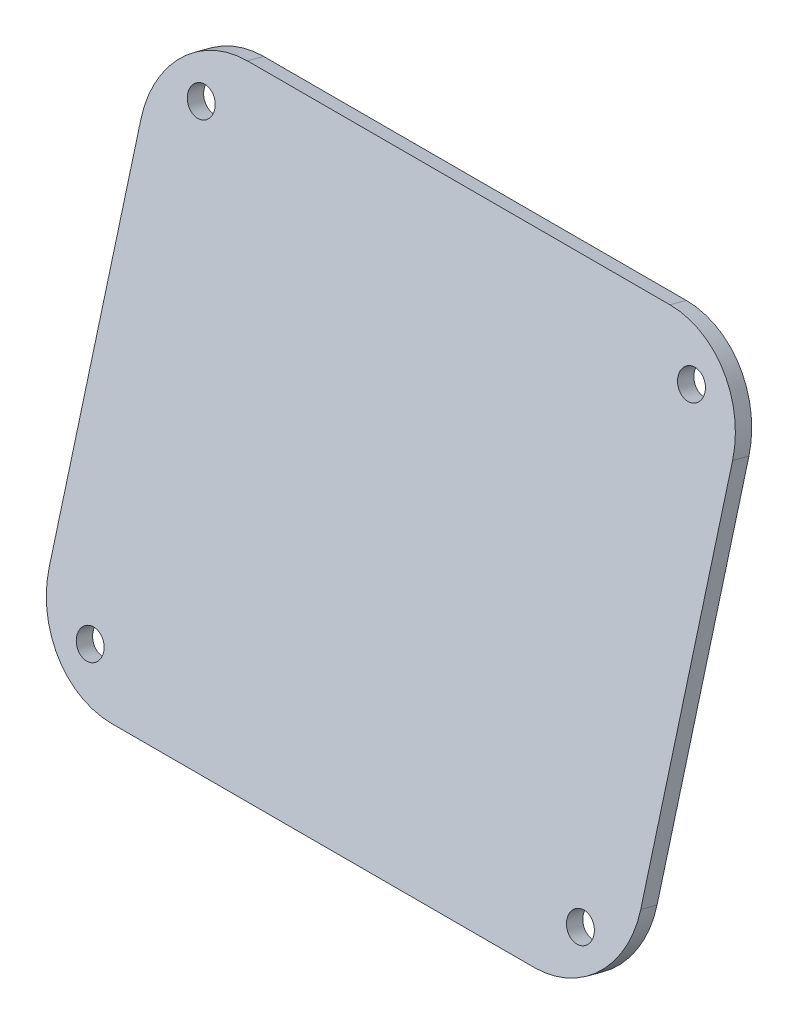
ISO-10303-21;
HEADER;
FILE_DESCRIPTION(('STEP AP214'),'2;1');
FILE_NAME('part.step','',(''),(''),'','','');
FILE_SCHEMA(('AUTOMOTIVE_DESIGN { 1 0 10303 214 1 1 1 1 }'));
ENDSEC;
DATA;
#1=APPLICATION_CONTEXT('core data for automotive mechanical design processes');
#2=APPLICATION_PROTOCOL_DEFINITION('international standard','automotive_design',2000,#1);
#3=PRODUCT_CONTEXT('',#1,'mechanical');
#4=PRODUCT('Part','Part','',(#3));
#5=PRODUCT_RELATED_PRODUCT_CATEGORY('part','',(#4));
#6=PRODUCT_DEFINITION_FORMATION('','',#4);
#7=PRODUCT_DEFINITION_CONTEXT('part definition',#1,'design');
#8=PRODUCT_DEFINITION('design','',#6,#7);
#9=PRODUCT_DEFINITION_SHAPE('','',#8);
#10=(LENGTH_UNIT() NAMED_UNIT(*) SI_UNIT(.MILLI.,.METRE.));
#11=(NAMED_UNIT(*) PLANE_ANGLE_UNIT() SI_UNIT($,.RADIAN.));
#12=(NAMED_UNIT(*) SI_UNIT($,.STERADIAN.) SOLID_ANGLE_UNIT());
#13=UNCERTAINTY_MEASURE_WITH_UNIT(LENGTH_MEASURE(1.E-05),#10,'distance_accuracy_value','');
#14=(GEOMETRIC_REPRESENTATION_CONTEXT(3) GLOBAL_UNCERTAINTY_ASSIGNED_CONTEXT((#13)) GLOBAL_UNIT_ASSIGNED_CONTEXT((#10,
#11,#12)) REPRESENTATION_CONTEXT('',''));
#15=CARTESIAN_POINT('',(0.,0.,0.));
#16=DIRECTION('',(0.,0.,1.));
#17=DIRECTION('',(1.,0.,0.));
#18=AXIS2_PLACEMENT_3D('',#15,#16,#17);
#19=CARTESIAN_POINT('',(-25.,-24.1765714851933,21.7333310915041));
#20=DIRECTION('',(0.,0.965925826289069,-0.258819045102518));
#21=DIRECTION('',(0.,0.258819045102518,0.965925826289069));
#22=AXIS2_PLACEMENT_3D('',#19,#20,#21);
#23=PLANE('',#22);
#24=DIRECTION('',(1.,0.,0.));
#25=VECTOR('',#24,1.);
#26=CARTESIAN_POINT('',(-25.,-24.6942095753984,19.8014794389259));
#27=LINE('',#26,#25);
#28=CARTESIAN_POINT('',(-25.,-24.6942095753984,19.8014794389259));
#29=VERTEX_POINT('',#28);
#30=CARTESIAN_POINT('',(25.,-24.6942095753984,19.8014794389259));
#31=VERTEX_POINT('',#30);
#32=EDGE_CURVE('E141',#29,#31,#27,.T.);
#33=ORIENTED_EDGE('',*,*,#32,.F.);
#34=DIRECTION('',(0.,-0.258819045102518,-0.965925826289069));
#35=VECTOR('',#34,1.);
#36=CARTESIAN_POINT('',(-25.,-24.1765714851933,21.7333310915041));
#37=LINE('',#36,#35);
#38=CARTESIAN_POINT('',(-25.,-24.1765714851933,21.7333310915041));
#39=VERTEX_POINT('',#38);
#40=EDGE_CURVE('E175',#39,#29,#37,.T.);
#41=ORIENTED_EDGE('',*,*,#40,.F.);
#42=DIRECTION('',(1.,0.,0.));
#43=VECTOR('',#42,1.);
#44=CARTESIAN_POINT('',(-25.,-24.1765714851933,21.7333310915041));
#45=LINE('',#44,#43);
#46=CARTESIAN_POINT('',(25.,-24.1765714851934,21.7333310915041));
#47=VERTEX_POINT('',#46);
#48=EDGE_CURVE('E160',#39,#47,#45,.T.);
#49=ORIENTED_EDGE('',*,*,#48,.T.);
#50=DIRECTION('',(0.,-0.258819045102518,-0.965925826289069));
#51=VECTOR('',#50,1.);
#52=CARTESIAN_POINT('',(25.,-24.1765714851934,21.7333310915041));
#53=LINE('',#52,#51);
#54=EDGE_CURVE('E138',#47,#31,#53,.T.);
#55=ORIENTED_EDGE('',*,*,#54,.T.);
#56=EDGE_LOOP('',(#33,#41,#49,#55));
#57=FACE_BOUND('',#56,.T.);
#58=ADVANCED_FACE('F41',(#57),#23,.T.);
#59=CARTESIAN_POINT('',(25.,-74.4047144522249,35.191921436835));
#60=DIRECTION('',(0.,-0.258819045102518,-0.965925826289069));
#61=DIRECTION('',(0.,0.965925826289069,-0.258819045102518));
#62=AXIS2_PLACEMENT_3D('',#59,#60,#61);
#63=CYLINDRICAL_SURFACE('',#62,10.);
#64=CARTESIAN_POINT('',(25.,-74.92235254243,33.2600697842568));
#65=DIRECTION('',(0.,0.258819045102518,0.965925826289069));
#66=DIRECTION('',(0.,-0.965925826289069,0.258819045102518));
#67=AXIS2_PLACEMENT_3D('',#64,#65,#66);
#68=CIRCLE('',#67,10.);
#69=CARTESIAN_POINT('',(35.,-74.92235254243,33.2600697842568));
#70=VERTEX_POINT('',#69);
#71=CARTESIAN_POINT('',(25.,-84.5816108053207,35.848260235282));
#72=VERTEX_POINT('',#71);
#73=EDGE_CURVE('E83',#70,#72,#68,.F.);
#74=ORIENTED_EDGE('',*,*,#73,.F.);
#75=DIRECTION('',(0.,-0.258819045102518,-0.965925826289069));
#76=VECTOR('',#75,1.);
#77=CARTESIAN_POINT('',(35.,-74.4047144522249,35.191921436835));
#78=LINE('',#77,#76);
#79=CARTESIAN_POINT('',(35.,-74.4047144522249,35.191921436835));
#80=VERTEX_POINT('',#79);
#81=EDGE_CURVE('E187',#80,#70,#78,.T.);
#82=ORIENTED_EDGE('',*,*,#81,.F.);
#83=CARTESIAN_POINT('',(25.,-74.4047144522249,35.191921436835));
#84=DIRECTION('',(0.,-0.258819045102518,-0.965925826289069));
#85=DIRECTION('',(0.,0.965925826289069,-0.258819045102518));
#86=AXIS2_PLACEMENT_3D('',#83,#84,#85);
#87=CIRCLE('',#86,10.);
#88=CARTESIAN_POINT('',(25.,-84.0639727151156,37.7801118878602));
#89=VERTEX_POINT('',#88);
#90=EDGE_CURVE('E136',#80,#89,#87,.T.);
#91=ORIENTED_EDGE('',*,*,#90,.T.);
#92=DIRECTION('',(0.,-0.258819045102518,-0.965925826289069));
#93=VECTOR('',#92,1.);
#94=CARTESIAN_POINT('',(25.,-84.0639727151156,37.7801118878602));
#95=LINE('',#94,#93);
#96=EDGE_CURVE('E131',#89,#72,#95,.T.);
#97=ORIENTED_EDGE('',*,*,#96,.T.);
#98=EDGE_LOOP('',(#74,#82,#91,#97));
#99=FACE_BOUND('',#98,.T.);
#100=ADVANCED_FACE('F226',(#99),#63,.T.);
#101=CARTESIAN_POINT('',(35.,-33.835829748084,24.3215215425292));
#102=DIRECTION('',(1.,0.,0.));
#103=DIRECTION('',(0.,1.,0.));
#104=AXIS2_PLACEMENT_3D('',#101,#102,#103);
#105=PLANE('',#104);
#106=DIRECTION('',(0.,-0.965925826289069,0.258819045102518));
#107=VECTOR('',#106,1.);
#108=CARTESIAN_POINT('',(35.,-34.3534678382891,22.3896698899511));
#109=LINE('',#108,#107);
#110=CARTESIAN_POINT('',(35.,-34.3534678382891,22.3896698899511));
#111=VERTEX_POINT('',#110);
#112=EDGE_CURVE('E12',#111,#70,#109,.T.);
#113=ORIENTED_EDGE('',*,*,#112,.F.);
#114=DIRECTION('',(0.,-0.258819045102518,-0.965925826289069));
#115=VECTOR('',#114,1.);
#116=CARTESIAN_POINT('',(35.,-33.835829748084,24.3215215425292));
#117=LINE('',#116,#115);
#118=CARTESIAN_POINT('',(35.,-33.835829748084,24.3215215425292));
#119=VERTEX_POINT('',#118);
#120=EDGE_CURVE('E176',#119,#111,#117,.T.);
#121=ORIENTED_EDGE('',*,*,#120,.F.);
#122=DIRECTION('',(0.,-0.965925826289069,0.258819045102518));
#123=VECTOR('',#122,1.);
#124=CARTESIAN_POINT('',(35.,-33.835829748084,24.3215215425292));
#125=LINE('',#124,#123);
#126=EDGE_CURVE('E189',#119,#80,#125,.T.);
#127=ORIENTED_EDGE('',*,*,#126,.T.);
#128=ORIENTED_EDGE('',*,*,#81,.T.);
#129=EDGE_LOOP('',(#113,#121,#127,#128));
#130=FACE_BOUND('',#129,.T.);
#131=ADVANCED_FACE('F231',(#130),#105,.T.);
#132=CARTESIAN_POINT('',(25.,-33.835829748084,24.3215215425292));
#133=DIRECTION('',(0.,-0.258819045102518,-0.965925826289069));
#134=DIRECTION('',(0.,0.965925826289069,-0.258819045102518));
#135=AXIS2_PLACEMENT_3D('',#132,#133,#134);
#136=CYLINDRICAL_SURFACE('',#135,10.);
#137=CARTESIAN_POINT('',(25.,-34.3534678382891,22.3896698899511));
#138=DIRECTION('',(0.,0.258819045102518,0.965925826289069));
#139=DIRECTION('',(0.,-0.965925826289069,0.258819045102518));
#140=AXIS2_PLACEMENT_3D('',#137,#138,#139);
#141=CIRCLE('',#140,10.);
#142=EDGE_CURVE('E51',#31,#111,#141,.F.);
#143=ORIENTED_EDGE('',*,*,#142,.F.);
#144=ORIENTED_EDGE('',*,*,#54,.F.);
#145=CARTESIAN_POINT('',(25.,-33.835829748084,24.3215215425292));
#146=DIRECTION('',(0.,-0.258819045102518,-0.965925826289069));
#147=DIRECTION('',(0.,0.965925826289069,-0.258819045102518));
#148=AXIS2_PLACEMENT_3D('',#145,#146,#147);
#149=CIRCLE('',#148,10.);
#150=EDGE_CURVE('E171',#47,#119,#149,.T.);
#151=ORIENTED_EDGE('',*,*,#150,.T.);
#152=ORIENTED_EDGE('',*,*,#120,.T.);
#153=EDGE_LOOP('',(#143,#144,#151,#152));
#154=FACE_BOUND('',#153,.T.);
#155=ADVANCED_FACE('F238',(#154),#136,.T.);
#156=CARTESIAN_POINT('',(-25.,-33.835829748084,24.3215215425292));
#157=DIRECTION('',(0.,-0.258819045102518,-0.965925826289069));
#158=DIRECTION('',(0.,0.965925826289069,-0.258819045102518));
#159=AXIS2_PLACEMENT_3D('',#156,#157,#158);
#160=CYLINDRICAL_SURFACE('',#159,10.);
#161=CARTESIAN_POINT('',(-25.,-34.3534678382891,22.3896698899511));
#162=DIRECTION('',(0.,0.258819045102518,0.965925826289069));
#163=DIRECTION('',(0.,-0.965925826289069,0.258819045102518));
#164=AXIS2_PLACEMENT_3D('',#161,#162,#163);
#165=CIRCLE('',#164,10.);
#166=CARTESIAN_POINT('',(-35.,-34.3534678382891,22.3896698899511));
#167=VERTEX_POINT('',#166);
#168=EDGE_CURVE('E143',#167,#29,#165,.F.);
#169=ORIENTED_EDGE('',*,*,#168,.F.);
#170=DIRECTION('',(0.,-0.258819045102518,-0.965925826289069));
#171=VECTOR('',#170,1.);
#172=CARTESIAN_POINT('',(-35.,-33.835829748084,24.3215215425292));
#173=LINE('',#172,#171);
#174=CARTESIAN_POINT('',(-35.,-33.835829748084,24.3215215425292));
#175=VERTEX_POINT('',#174);
#176=EDGE_CURVE('E127',#175,#167,#173,.T.);
#177=ORIENTED_EDGE('',*,*,#176,.F.);
#178=CARTESIAN_POINT('',(-25.,-33.835829748084,24.3215215425292));
#179=DIRECTION('',(0.,-0.258819045102518,-0.965925826289069));
#180=DIRECTION('',(0.,-0.965925826289069,0.258819045102518));
#181=AXIS2_PLACEMENT_3D('',#178,#179,#180);
#182=CIRCLE('',#181,10.);
#183=EDGE_CURVE('E173',#175,#39,#182,.T.);
#184=ORIENTED_EDGE('',*,*,#183,.T.);
#185=ORIENTED_EDGE('',*,*,#40,.T.);
#186=EDGE_LOOP('',(#169,#177,#184,#185));
#187=FACE_BOUND('',#186,.T.);
#188=ADVANCED_FACE('F236',(#187),#160,.T.);
#189=CARTESIAN_POINT('',(-35.,-74.4047144522249,35.191921436835));
#190=DIRECTION('',(-1.,0.,0.));
#191=DIRECTION('',(0.,-1.,0.));
#192=AXIS2_PLACEMENT_3D('',#189,#190,#191);
#193=PLANE('',#192);
#194=DIRECTION('',(0.,0.965925826289069,-0.258819045102518));
#195=VECTOR('',#194,1.);
#196=CARTESIAN_POINT('',(-35.,-74.92235254243,33.2600697842568));
#197=LINE('',#196,#195);
#198=CARTESIAN_POINT('',(-35.,-74.92235254243,33.2600697842568));
#199=VERTEX_POINT('',#198);
#200=EDGE_CURVE('E145',#199,#167,#197,.T.);
#201=ORIENTED_EDGE('',*,*,#200,.F.);
#202=DIRECTION('',(0.,-0.258819045102518,-0.965925826289069));
#203=VECTOR('',#202,1.);
#204=CARTESIAN_POINT('',(-35.,-74.4047144522249,35.191921436835));
#205=LINE('',#204,#203);
#206=CARTESIAN_POINT('',(-35.,-74.4047144522249,35.191921436835));
#207=VERTEX_POINT('',#206);
#208=EDGE_CURVE('E126',#207,#199,#205,.T.);
#209=ORIENTED_EDGE('',*,*,#208,.F.);
#210=DIRECTION('',(0.,0.965925826289069,-0.258819045102518));
#211=VECTOR('',#210,1.);
#212=CARTESIAN_POINT('',(-35.,-74.4047144522249,35.191921436835));
#213=LINE('',#212,#211);
#214=EDGE_CURVE('E125',#207,#175,#213,.T.);
#215=ORIENTED_EDGE('',*,*,#214,.T.);
#216=ORIENTED_EDGE('',*,*,#176,.T.);
#217=EDGE_LOOP('',(#201,#209,#215,#216));
#218=FACE_BOUND('',#217,.T.);
#219=ADVANCED_FACE('F248',(#218),#193,.T.);
#220=CARTESIAN_POINT('',(-25.,-74.4047144522249,35.191921436835));
#221=DIRECTION('',(0.,-0.258819045102518,-0.965925826289069));
#222=DIRECTION('',(0.,0.965925826289069,-0.258819045102518));
#223=AXIS2_PLACEMENT_3D('',#220,#221,#222);
#224=CYLINDRICAL_SURFACE('',#223,10.);
#225=CARTESIAN_POINT('',(-25.,-74.92235254243,33.2600697842568));
#226=DIRECTION('',(0.,0.258819045102518,0.965925826289069));
#227=DIRECTION('',(0.,-0.965925826289069,0.258819045102518));
#228=AXIS2_PLACEMENT_3D('',#225,#226,#227);
#229=CIRCLE('',#228,10.);
#230=CARTESIAN_POINT('',(-25.,-84.5816108053207,35.848260235282));
#231=VERTEX_POINT('',#230);
#232=EDGE_CURVE('E77',#231,#199,#229,.F.);
#233=ORIENTED_EDGE('',*,*,#232,.F.);
#234=DIRECTION('',(0.,-0.258819045102518,-0.965925826289069));
#235=VECTOR('',#234,1.);
#236=CARTESIAN_POINT('',(-25.,-84.0639727151156,37.7801118878602));
#237=LINE('',#236,#235);
#238=CARTESIAN_POINT('',(-25.,-84.0639727151156,37.7801118878602));
#239=VERTEX_POINT('',#238);
#240=EDGE_CURVE('E108',#239,#231,#237,.T.);
#241=ORIENTED_EDGE('',*,*,#240,.F.);
#242=CARTESIAN_POINT('',(-25.,-74.4047144522249,35.191921436835));
#243=DIRECTION('',(0.,-0.258819045102518,-0.965925826289069));
#244=DIRECTION('',(0.,0.965925826289069,-0.258819045102518));
#245=AXIS2_PLACEMENT_3D('',#242,#243,#244);
#246=CIRCLE('',#245,10.);
#247=EDGE_CURVE('E112',#239,#207,#246,.T.);
#248=ORIENTED_EDGE('',*,*,#247,.T.);
#249=ORIENTED_EDGE('',*,*,#208,.T.);
#250=EDGE_LOOP('',(#233,#241,#248,#249));
#251=FACE_BOUND('',#250,.T.);
#252=ADVANCED_FACE('F110',(#251),#224,.T.);
#253=CARTESIAN_POINT('',(25.,-84.0639727151156,37.7801118878602));
#254=DIRECTION('',(0.,-0.965925826289069,0.258819045102518));
#255=DIRECTION('',(0.,-0.258819045102518,-0.965925826289069));
#256=AXIS2_PLACEMENT_3D('',#253,#254,#255);
#257=PLANE('',#256);
#258=DIRECTION('',(-1.,0.,0.));
#259=VECTOR('',#258,1.);
#260=CARTESIAN_POINT('',(-36.7912780858398,-84.5816108053207,35.848260235282));
#261=LINE('',#260,#259);
#262=EDGE_CURVE('E81',#72,#231,#261,.T.);
#263=ORIENTED_EDGE('',*,*,#262,.F.);
#264=ORIENTED_EDGE('',*,*,#96,.F.);
#265=DIRECTION('',(-1.,0.,0.));
#266=VECTOR('',#265,1.);
#267=CARTESIAN_POINT('',(25.,-84.0639727151156,37.7801118878602));
#268=LINE('',#267,#266);
#269=EDGE_CURVE('E115',#89,#239,#268,.T.);
#270=ORIENTED_EDGE('',*,*,#269,.T.);
#271=ORIENTED_EDGE('',*,*,#240,.T.);
#272=EDGE_LOOP('',(#263,#264,#270,#271));
#273=FACE_BOUND('',#272,.T.);
#274=ADVANCED_FACE('F129',(#273),#257,.T.);
#275=CARTESIAN_POINT('',(25.,-74.4047144522249,35.191921436835));
#276=DIRECTION('',(0.,-0.258819045102518,-0.965925826289069));
#277=DIRECTION('',(0.,0.965925826289069,-0.258819045102518));
#278=AXIS2_PLACEMENT_3D('',#275,#276,#277);
#279=PLANE('',#278);
#280=CARTESIAN_POINT('',(-29.,-78.6383990415926,36.3263338035641));
#281=DIRECTION('',(0.,0.258819045102518,0.965925826289069));
#282=DIRECTION('',(0.,-0.965925826289069,0.258819045102518));
#283=AXIS2_PLACEMENT_3D('',#280,#281,#282);
#284=CIRCLE('',#283,1.6);
#285=CARTESIAN_POINT('',(-29.,-80.1838803636551,36.7404442757282));
#286=VERTEX_POINT('',#285);
#287=EDGE_CURVE('E199',#286,#286,#284,.T.);
#288=ORIENTED_EDGE('',*,*,#287,.F.);
#289=EDGE_LOOP('',(#288));
#290=FACE_BOUND('',#289,.T.);
#291=CARTESIAN_POINT('',(29.,-78.6383990415926,36.3263338035641));
#292=DIRECTION('',(0.,0.258819045102518,0.965925826289069));
#293=DIRECTION('',(0.,-0.965925826289069,0.258819045102518));
#294=AXIS2_PLACEMENT_3D('',#291,#292,#293);
#295=CIRCLE('',#294,1.6);
#296=CARTESIAN_POINT('',(29.,-80.1838803636551,36.7404442757282));
#297=VERTEX_POINT('',#296);
#298=EDGE_CURVE('E202',#297,#297,#295,.T.);
#299=ORIENTED_EDGE('',*,*,#298,.F.);
#300=EDGE_LOOP('',(#299));
#301=FACE_BOUND('',#300,.T.);
#302=CARTESIAN_POINT('',(29.,-29.6021451587164,23.1871091758001));
#303=DIRECTION('',(0.,0.258819045102518,0.965925826289069));
#304=DIRECTION('',(0.,-0.965925826289069,0.258819045102518));
#305=AXIS2_PLACEMENT_3D('',#302,#303,#304);
#306=CIRCLE('',#305,1.6);
#307=CARTESIAN_POINT('',(29.,-31.1476264807789,23.6012196479641));
#308=VERTEX_POINT('',#307);
#309=EDGE_CURVE('E198',#308,#308,#306,.T.);
#310=ORIENTED_EDGE('',*,*,#309,.F.);
#311=EDGE_LOOP('',(#310));
#312=FACE_BOUND('',#311,.T.);
#313=CARTESIAN_POINT('',(-29.,-29.6021451587164,23.1871091758001));
#314=DIRECTION('',(0.,0.258819045102518,0.965925826289069));
#315=DIRECTION('',(0.,-0.965925826289069,0.258819045102518));
#316=AXIS2_PLACEMENT_3D('',#313,#314,#315);
#317=CIRCLE('',#316,1.6);
#318=CARTESIAN_POINT('',(-29.,-31.1476264807789,23.6012196479641));
#319=VERTEX_POINT('',#318);
#320=EDGE_CURVE('E153',#319,#319,#317,.T.);
#321=ORIENTED_EDGE('',*,*,#320,.F.);
#322=EDGE_LOOP('',(#321));
#323=FACE_BOUND('',#322,.T.);
#324=ORIENTED_EDGE('',*,*,#90,.F.);
#325=ORIENTED_EDGE('',*,*,#126,.F.);
#326=ORIENTED_EDGE('',*,*,#150,.F.);
#327=ORIENTED_EDGE('',*,*,#48,.F.);
#328=ORIENTED_EDGE('',*,*,#183,.F.);
#329=ORIENTED_EDGE('',*,*,#214,.F.);
#330=ORIENTED_EDGE('',*,*,#247,.F.);
#331=ORIENTED_EDGE('',*,*,#269,.F.);
#332=EDGE_LOOP('',(#324,#325,#326,#327,#328,#329,#330,#331));
#333=FACE_BOUND('',#332,.T.);
#334=ADVANCED_FACE('F121',(#290,#301,#312,#323,#333),#279,.F.);
#335=CARTESIAN_POINT('',(-36.7912780858398,13.9428234761644,9.44871763482517));
#336=DIRECTION('',(0.,0.258819045102518,0.965925826289069));
#337=DIRECTION('',(0.,-0.965925826289069,0.258819045102518));
#338=AXIS2_PLACEMENT_3D('',#335,#336,#337);
#339=PLANE('',#338);
#340=CARTESIAN_POINT('',(-29.,-79.1560371317976,34.394482150986));
#341=DIRECTION('',(0.,0.258819045102518,0.965925826289069));
#342=DIRECTION('',(0.,-0.965925826289069,0.258819045102518));
#343=AXIS2_PLACEMENT_3D('',#340,#341,#342);
#344=CIRCLE('',#343,1.6);
#345=CARTESIAN_POINT('',(-29.,-80.7015184538601,34.80859262315));
#346=VERTEX_POINT('',#345);
#347=EDGE_CURVE('E45',#346,#346,#344,.T.);
#348=ORIENTED_EDGE('',*,*,#347,.T.);
#349=EDGE_LOOP('',(#348));
#350=FACE_BOUND('',#349,.T.);
#351=CARTESIAN_POINT('',(29.,-79.1560371317976,34.394482150986));
#352=DIRECTION('',(0.,0.258819045102518,0.965925826289069));
#353=DIRECTION('',(0.,-0.965925826289069,0.258819045102518));
#354=AXIS2_PLACEMENT_3D('',#351,#352,#353);
#355=CIRCLE('',#354,1.6);
#356=CARTESIAN_POINT('',(29.,-80.7015184538601,34.80859262315));
#357=VERTEX_POINT('',#356);
#358=EDGE_CURVE('E155',#357,#357,#355,.T.);
#359=ORIENTED_EDGE('',*,*,#358,.T.);
#360=EDGE_LOOP('',(#359));
#361=FACE_BOUND('',#360,.T.);
#362=CARTESIAN_POINT('',(29.,-30.1197832489214,21.2552575232219));
#363=DIRECTION('',(0.,0.258819045102518,0.965925826289069));
#364=DIRECTION('',(0.,-0.965925826289069,0.258819045102518));
#365=AXIS2_PLACEMENT_3D('',#362,#363,#364);
#366=CIRCLE('',#365,1.6);
#367=CARTESIAN_POINT('',(29.,-31.6652645709839,21.669367995386));
#368=VERTEX_POINT('',#367);
#369=EDGE_CURVE('E152',#368,#368,#366,.T.);
#370=ORIENTED_EDGE('',*,*,#369,.T.);
#371=EDGE_LOOP('',(#370));
#372=FACE_BOUND('',#371,.T.);
#373=CARTESIAN_POINT('',(-29.,-30.1197832489214,21.2552575232219));
#374=DIRECTION('',(0.,0.258819045102518,0.965925826289069));
#375=DIRECTION('',(0.,-0.965925826289069,0.258819045102518));
#376=AXIS2_PLACEMENT_3D('',#373,#374,#375);
#377=CIRCLE('',#376,1.6);
#378=CARTESIAN_POINT('',(-29.,-31.6652645709839,21.669367995386));
#379=VERTEX_POINT('',#378);
#380=EDGE_CURVE('E149',#379,#379,#377,.T.);
#381=ORIENTED_EDGE('',*,*,#380,.T.);
#382=EDGE_LOOP('',(#381));
#383=FACE_BOUND('',#382,.T.);
#384=ORIENTED_EDGE('',*,*,#73,.T.);
#385=ORIENTED_EDGE('',*,*,#262,.T.);
#386=ORIENTED_EDGE('',*,*,#232,.T.);
#387=ORIENTED_EDGE('',*,*,#200,.T.);
#388=ORIENTED_EDGE('',*,*,#168,.T.);
#389=ORIENTED_EDGE('',*,*,#32,.T.);
#390=ORIENTED_EDGE('',*,*,#142,.T.);
#391=ORIENTED_EDGE('',*,*,#112,.T.);
#392=EDGE_LOOP('',(#384,#385,#386,#387,#388,#389,#390,#391));
#393=FACE_BOUND('',#392,.T.);
#394=ADVANCED_FACE('F43',(#350,#361,#372,#383,#393),#339,.F.);
#395=CARTESIAN_POINT('',(-29.,-56.0016877591732,-75.337325105685));
#396=DIRECTION('',(0.,0.258819045102518,0.965925826289069));
#397=DIRECTION('',(0.,-0.965925826289069,0.258819045102518));
#398=AXIS2_PLACEMENT_3D('',#395,#396,#397);
#399=CYLINDRICAL_SURFACE('',#398,1.6);
#400=ORIENTED_EDGE('',*,*,#320,.T.);
#401=EDGE_LOOP('',(#400));
#402=FACE_BOUND('',#401,.T.);
#403=ORIENTED_EDGE('',*,*,#380,.F.);
#404=EDGE_LOOP('',(#403));
#405=FACE_BOUND('',#404,.T.);
#406=ADVANCED_FACE('F216',(#402,#405),#399,.F.);
#407=CARTESIAN_POINT('',(29.,-56.0016877591732,-75.337325105685));
#408=DIRECTION('',(0.,0.258819045102518,0.965925826289069));
#409=DIRECTION('',(0.,-0.965925826289069,0.258819045102518));
#410=AXIS2_PLACEMENT_3D('',#407,#408,#409);
#411=CYLINDRICAL_SURFACE('',#410,1.6);
#412=ORIENTED_EDGE('',*,*,#309,.T.);
#413=EDGE_LOOP('',(#412));
#414=FACE_BOUND('',#413,.T.);
#415=ORIENTED_EDGE('',*,*,#369,.F.);
#416=EDGE_LOOP('',(#415));
#417=FACE_BOUND('',#416,.T.);
#418=ADVANCED_FACE('F208',(#414,#417),#411,.F.);
#419=CARTESIAN_POINT('',(29.,-105.037941642049,-62.198100477921));
#420=DIRECTION('',(0.,0.258819045102518,0.965925826289069));
#421=DIRECTION('',(0.,-0.965925826289069,0.258819045102518));
#422=AXIS2_PLACEMENT_3D('',#419,#420,#421);
#423=CYLINDRICAL_SURFACE('',#422,1.6);
#424=ORIENTED_EDGE('',*,*,#298,.T.);
#425=EDGE_LOOP('',(#424));
#426=FACE_BOUND('',#425,.T.);
#427=ORIENTED_EDGE('',*,*,#358,.F.);
#428=EDGE_LOOP('',(#427));
#429=FACE_BOUND('',#428,.T.);
#430=ADVANCED_FACE('F261',(#426,#429),#423,.F.);
#431=CARTESIAN_POINT('',(-29.,-105.037941642049,-62.198100477921));
#432=DIRECTION('',(0.,0.258819045102518,0.965925826289069));
#433=DIRECTION('',(0.,-0.965925826289069,0.258819045102518));
#434=AXIS2_PLACEMENT_3D('',#431,#432,#433);
#435=CYLINDRICAL_SURFACE('',#434,1.6);
#436=ORIENTED_EDGE('',*,*,#287,.T.);
#437=EDGE_LOOP('',(#436));
#438=FACE_BOUND('',#437,.T.);
#439=ORIENTED_EDGE('',*,*,#347,.F.);
#440=EDGE_LOOP('',(#439));
#441=FACE_BOUND('',#440,.T.);
#442=ADVANCED_FACE('F258',(#438,#441),#435,.F.);
#443=CLOSED_SHELL('',(#58,#100,#131,#155,#188,#219,#252,#274,#334,#394,#406,#418,#430,#442));
#444=MANIFOLD_SOLID_BREP('B2',#443);
#445=ADVANCED_BREP_SHAPE_REPRESENTATION('',(#18,#444),#14);
#446=SHAPE_DEFINITION_REPRESENTATION(#9,#445);
ENDSEC;
END-ISO-10303-21;
